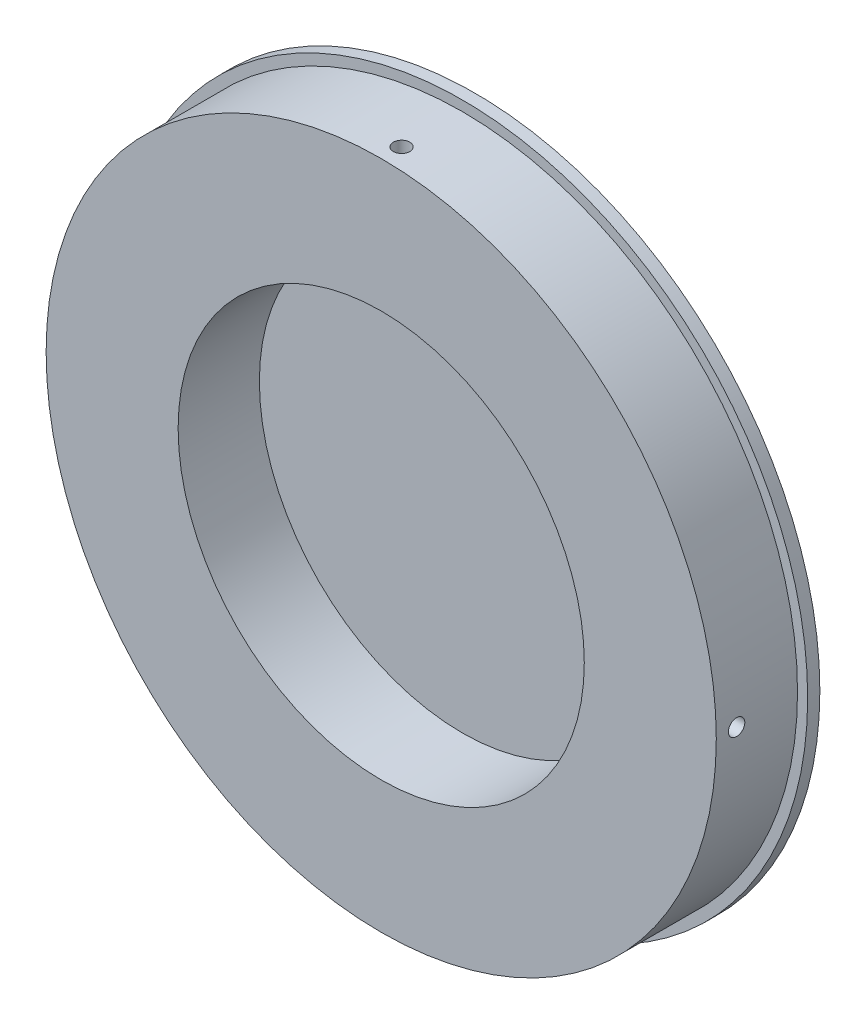
ISO-10303-21;
HEADER;
FILE_DESCRIPTION(('STEP AP214'),'2;1');
FILE_NAME('part.step','',(''),(''),'','','');
FILE_SCHEMA(('AUTOMOTIVE_DESIGN { 1 0 10303 214 1 1 1 1 }'));
ENDSEC;
DATA;
#1=APPLICATION_CONTEXT('core data for automotive mechanical design processes');
#2=APPLICATION_PROTOCOL_DEFINITION('international standard','automotive_design',2000,#1);
#3=PRODUCT_CONTEXT('',#1,'mechanical');
#4=PRODUCT('Part','Part','',(#3));
#5=PRODUCT_RELATED_PRODUCT_CATEGORY('part','',(#4));
#6=PRODUCT_DEFINITION_FORMATION('','',#4);
#7=PRODUCT_DEFINITION_CONTEXT('part definition',#1,'design');
#8=PRODUCT_DEFINITION('design','',#6,#7);
#9=PRODUCT_DEFINITION_SHAPE('','',#8);
#10=(LENGTH_UNIT() NAMED_UNIT(*) SI_UNIT(.MILLI.,.METRE.));
#11=(NAMED_UNIT(*) PLANE_ANGLE_UNIT() SI_UNIT($,.RADIAN.));
#12=(NAMED_UNIT(*) SI_UNIT($,.STERADIAN.) SOLID_ANGLE_UNIT());
#13=UNCERTAINTY_MEASURE_WITH_UNIT(LENGTH_MEASURE(1.E-05),#10,'distance_accuracy_value','');
#14=(GEOMETRIC_REPRESENTATION_CONTEXT(3) GLOBAL_UNCERTAINTY_ASSIGNED_CONTEXT((#13)) GLOBAL_UNIT_ASSIGNED_CONTEXT((#10,
#11,#12)) REPRESENTATION_CONTEXT('',''));
#15=CARTESIAN_POINT('',(0.,0.,0.));
#16=DIRECTION('',(0.,0.,1.));
#17=DIRECTION('',(1.,0.,0.));
#18=AXIS2_PLACEMENT_3D('',#15,#16,#17);
#19=CARTESIAN_POINT('',(0.,0.,23.));
#20=DIRECTION('',(0.,0.,-1.));
#21=DIRECTION('',(-1.,0.,0.));
#22=AXIS2_PLACEMENT_3D('',#19,#20,#21);
#23=CYLINDRICAL_SURFACE('',#22,82.5);
#24=CARTESIAN_POINT('',(82.5,0.,15.9807));
#25=CARTESIAN_POINT('',(82.4999996666297,-0.1134067445928,15.9807050235358));
#26=CARTESIAN_POINT('',(82.4997636527001,-0.226895287378577,15.9902856888799));
#27=CARTESIAN_POINT('',(82.498844835163,-0.450745589516307,16.028371214423));
#28=CARTESIAN_POINT('',(82.4981614965099,-0.561103439109121,16.0568987375818));
#29=CARTESIAN_POINT('',(82.4964254240408,-0.775417012689514,16.1320642577982));
#30=CARTESIAN_POINT('',(82.4953728695285,-0.879375815514723,16.1786934652409));
#31=CARTESIAN_POINT('',(82.4930171256612,-1.07796084138429,16.2887262920352));
#32=CARTESIAN_POINT('',(82.4917139978917,-1.17258934898132,16.3521257910555));
#33=CARTESIAN_POINT('',(82.4890033511544,-1.34989018576618,16.4939263721117));
#34=CARTESIAN_POINT('',(82.48759580185,-1.43255901966426,16.5723318242422));
#35=CARTESIAN_POINT('',(82.4848352221059,-1.58356466205927,16.741911690783));
#36=CARTESIAN_POINT('',(82.483482193829,-1.65190090244071,16.8330866111108));
#37=CARTESIAN_POINT('',(82.4809831204141,-1.77230463883914,17.0256272400537));
#38=CARTESIAN_POINT('',(82.4798370974276,-1.82437039419604,17.1269940374908));
#39=CARTESIAN_POINT('',(82.477881492917,-1.91074372500279,17.337033151369));
#40=CARTESIAN_POINT('',(82.4770719102687,-1.94505135979394,17.4457054433963));
#41=CARTESIAN_POINT('',(82.4758806618706,-1.99492804762409,17.6672476414711));
#42=CARTESIAN_POINT('',(82.4754989100679,-2.01050086898728,17.7801166986703));
#43=CARTESIAN_POINT('',(82.4752061073569,-2.02247746904215,18.0068676094531));
#44=CARTESIAN_POINT('',(82.4752950549144,-2.01888131021499,18.1207494597344));
#45=CARTESIAN_POINT('',(82.4759335402694,-1.99262525727334,18.3462676915282));
#46=CARTESIAN_POINT('',(82.4764829794106,-1.96996944651931,18.4579045487654));
#47=CARTESIAN_POINT('',(82.4779803524459,-1.90624351424478,18.6757898733805));
#48=CARTESIAN_POINT('',(82.4789282870648,-1.8651733592313,18.7820383309573));
#49=CARTESIAN_POINT('',(82.4811159009001,-1.76577989053998,18.9861439159084));
#50=CARTESIAN_POINT('',(82.4823556117813,-1.70745470409879,19.0840001309485));
#51=CARTESIAN_POINT('',(82.484986986921,-1.57520822943608,19.2685334022443));
#52=CARTESIAN_POINT('',(82.4863786513902,-1.50128691959968,19.3552104430063));
#53=CARTESIAN_POINT('',(82.489157485577,-1.33992344087389,19.5149487247769));
#54=CARTESIAN_POINT('',(82.490544654019,-1.25247772785785,19.5880063856707));
#55=CARTESIAN_POINT('',(82.4931577620787,-1.06656023711035,19.7184044897403));
#56=CARTESIAN_POINT('',(82.4943837016721,-0.968088457721153,19.775744930553));
#57=CARTESIAN_POINT('',(82.4965361602595,-0.76291215277011,19.8730804758592));
#58=CARTESIAN_POINT('',(82.4974626773547,-0.656207575006679,19.91307547036));
#59=CARTESIAN_POINT('',(82.498911812289,-0.437595549296186,19.9745825245343));
#60=CARTESIAN_POINT('',(82.4994344308658,-0.325688110854285,19.996094617973));
#61=CARTESIAN_POINT('',(82.5000167602246,-0.0998781489973501,20.020020833472));
#62=CARTESIAN_POINT('',(82.5000765910642,0.0140238492985089,20.0224399086942));
#63=CARTESIAN_POINT('',(82.4997269180994,0.240616951637763,20.0081243225889));
#64=CARTESIAN_POINT('',(82.4993174146498,0.353308056596517,19.9913896757416));
#65=CARTESIAN_POINT('',(82.4980753076527,0.574266652402211,19.9392457842576));
#66=CARTESIAN_POINT('',(82.497242754999,0.682534673663251,19.9038387859253));
#67=CARTESIAN_POINT('',(82.4952483817018,0.891590006507672,19.8153575588886));
#68=CARTESIAN_POINT('',(82.4940865606317,0.99237730840071,19.762283307299));
#69=CARTESIAN_POINT('',(82.4915642673822,1.18363300015171,19.639961407242));
#70=CARTESIAN_POINT('',(82.4902037542586,1.27409925631569,19.5707104235061));
#71=CARTESIAN_POINT('',(82.4874375624184,1.44212341399379,19.4180057499197));
#72=CARTESIAN_POINT('',(82.486031883619,1.51968129182415,19.3345520340112));
#73=CARTESIAN_POINT('',(82.4833334899435,1.6597035937652,19.1557896513498));
#74=CARTESIAN_POINT('',(82.4820407990242,1.72216482187854,19.0604784808027));
#75=CARTESIAN_POINT('',(82.4797145021758,1.83019889289644,18.860719582373));
#76=CARTESIAN_POINT('',(82.4786808957665,1.87577176710564,18.7562718714265));
#77=CARTESIAN_POINT('',(82.4769894736531,1.94872989627561,18.5412168518254));
#78=CARTESIAN_POINT('',(82.4763316150783,1.97611722616477,18.4306102474478));
#79=CARTESIAN_POINT('',(82.4754657386439,2.01193365071974,18.206367117441));
#80=CARTESIAN_POINT('',(82.4752577207924,2.02036274504609,18.0927305917577));
#81=CARTESIAN_POINT('',(82.4753149949794,2.01802316260126,17.8656854956158));
#82=CARTESIAN_POINT('',(82.4755801624859,2.00725953693089,17.7522768730417));
#83=CARTESIAN_POINT('',(82.4765536524283,1.966850416689,17.5288768036462));
#84=CARTESIAN_POINT('',(82.4772619757474,1.93720488448521,17.4188853636359));
#85=CARTESIAN_POINT('',(82.4790419123397,1.85987393754577,17.2054393915149));
#86=CARTESIAN_POINT('',(82.4801135320113,1.81218820508996,17.1019849745704));
#87=CARTESIAN_POINT('',(82.4824992031599,1.70013290905002,16.9045531243145));
#88=CARTESIAN_POINT('',(82.4838132456183,1.63576396608429,16.8105753386512));
#89=CARTESIAN_POINT('',(82.4865359362514,1.49215719781432,16.6347428508357));
#90=CARTESIAN_POINT('',(82.4879445992233,1.41291704337648,16.5528900513006));
#91=CARTESIAN_POINT('',(82.4906979445181,1.24179657901145,16.4036274790835));
#92=CARTESIAN_POINT('',(82.492042610892,1.14991314015949,16.3362212922028));
#93=CARTESIAN_POINT('',(82.4945167550373,0.956085100302505,16.2177576134748));
#94=CARTESIAN_POINT('',(82.495646105187,0.854134586371129,16.166709805389));
#95=CARTESIAN_POINT('',(82.4975599045913,0.643186597503595,16.0825143703101));
#96=CARTESIAN_POINT('',(82.4983447656533,0.534197716197418,16.0493453598489));
#97=CARTESIAN_POINT('',(82.4992709779592,0.353765256868499,16.0106559490644));
#98=CARTESIAN_POINT('',(82.499543177877,0.283493259589423,15.9994365643579));
#99=CARTESIAN_POINT('',(82.4999077933756,0.142158223915978,15.9844570159129));
#100=CARTESIAN_POINT('',(82.5000002089913,0.0710951856755066,15.9806968507233));
#101=CARTESIAN_POINT('',(82.5,0.,15.9807));
#102=B_SPLINE_CURVE_WITH_KNOTS('',3,(#24,#25,#26,#27,#28,#29,#30,#31,#32,#33,#34,#35,#36,#37,
#38,#39,#40,#41,#42,#43,#44,#45,#46,#47,#48,#49,#50,#51,#52,#53,#54,#55,#56,#57,#58,#59,#60,#61,
#62,#63,#64,#65,#66,#67,#68,#69,#70,#71,#72,#73,#74,#75,#76,#77,#78,#79,#80,#81,#82,#83,#84,#85,
#86,#87,#88,#89,#90,#91,#92,#93,#94,#95,#96,#97,#98,#99,#100,#101),.UNSPECIFIED.,.T.,.F.,(4,2,2,
2,2,2,2,2,2,2,2,2,2,2,2,2,2,2,2,2,2,2,2,2,2,2,2,2,2,2,2,2,2,2,2,2,2,2,4),(0.,0.33996073027684,
0.680328832871509,1.02053186960826,1.36065139859639,1.70087012970974,2.04110234386893,
2.38137094453113,2.72163840812978,3.0618374188123,3.40203532061919,3.74216035661495,
4.08228601125048,4.42244859474933,4.76261164968745,5.10286399729623,5.44311639606132,
5.78337095243719,6.12362488722285,6.463790549521,6.80395595465706,7.1440804468546,
7.48420537963352,7.8244005003087,8.16459624515314,8.50486394730253,8.84513101872099,
9.18535925978231,9.52558750693556,9.86572622672961,10.2058656244336,10.5460110128788,
10.8861437496706,11.2263298026786,11.566600195905,11.9070716503906,12.2471349842186,
12.4602578988239,12.6733807719669),.UNSPECIFIED.);
#103=CARTESIAN_POINT('',(82.5,0.,15.9807));
#104=VERTEX_POINT('',#103);
#105=EDGE_CURVE('E42',#104,#104,#102,.T.);
#106=ORIENTED_EDGE('',*,*,#105,.T.);
#107=EDGE_LOOP('',(#106));
#108=FACE_BOUND('',#107,.T.);
#109=CARTESIAN_POINT('',(0.,0.,23.));
#110=DIRECTION('',(0.,0.,1.));
#111=DIRECTION('',(1.,0.,0.));
#112=AXIS2_PLACEMENT_3D('',#109,#110,#111);
#113=CIRCLE('',#112,82.5);
#114=CARTESIAN_POINT('',(82.5,0.,23.));
#115=VERTEX_POINT('',#114);
#116=EDGE_CURVE('E96',#115,#115,#113,.T.);
#117=ORIENTED_EDGE('',*,*,#116,.F.);
#118=EDGE_LOOP('',(#117));
#119=FACE_BOUND('',#118,.T.);
#120=CARTESIAN_POINT('',(0.,0.,3.));
#121=DIRECTION('',(0.,0.,1.));
#122=DIRECTION('',(1.,0.,0.));
#123=AXIS2_PLACEMENT_3D('',#120,#121,#122);
#124=CIRCLE('',#123,82.5);
#125=CARTESIAN_POINT('',(82.5,0.,3.));
#126=VERTEX_POINT('',#125);
#127=EDGE_CURVE('E99',#126,#126,#124,.T.);
#128=ORIENTED_EDGE('',*,*,#127,.T.);
#129=EDGE_LOOP('',(#128));
#130=FACE_BOUND('',#129,.T.);
#131=CARTESIAN_POINT('',(-2.0193,82.4752837370688,18.));
#132=CARTESIAN_POINT('',(-2.01929497645894,82.4752840708288,18.1134067388541));
#133=CARTESIAN_POINT('',(-2.00971431205175,82.475520157458,18.226895275921));
#134=CARTESIAN_POINT('',(-1.97162879056804,82.4764392343232,18.4507455661764));
#135=CARTESIAN_POINT('',(-1.94310127051253,82.4771227597418,18.5611034096013));
#136=CARTESIAN_POINT('',(-1.86793575937624,82.4788592377726,18.7754169701443));
#137=CARTESIAN_POINT('',(-1.82130655805858,82.4799120110624,18.8793757661523));
#138=CARTESIAN_POINT('',(-1.71127374568386,82.4822681285276,19.0779607806211));
#139=CARTESIAN_POINT('',(-1.64787425494274,82.4835714111336,19.1725892836259));
#140=CARTESIAN_POINT('',(-1.50607368221338,82.4862822361354,19.3498901256838));
#141=CARTESIAN_POINT('',(-1.42766822828455,82.4876898088425,19.4325589679718));
#142=CARTESIAN_POINT('',(-1.25808835463563,82.4904502933808,19.5835646265347));
#143=CARTESIAN_POINT('',(-1.16691342902079,82.4918032030438,19.6519008747199));
#144=CARTESIAN_POINT('',(-0.974372795532834,82.494301949183,19.7723046192105));
#145=CARTESIAN_POINT('',(-0.873005999745911,82.4954477635167,19.8243703763081));
#146=CARTESIAN_POINT('',(-0.662966889456172,82.4974029521619,19.9107437107897));
#147=CARTESIAN_POINT('',(-0.554294599358348,82.4982123275973,19.9450513474938));
#148=CARTESIAN_POINT('',(-0.332752406838254,82.4994032539983,19.9949280394221));
#149=CARTESIAN_POINT('',(-0.219883353293958,82.4997848910012,20.0105008631033));
#150=CARTESIAN_POINT('',(0.00686755035890332,82.5000776067226,20.0224774690602));
#151=CARTESIAN_POINT('',(0.120749397166355,82.4999886869742,20.0188813137927));
#152=CARTESIAN_POINT('',(0.346267644856789,82.4993503877066,19.9926252664131));
#153=CARTESIAN_POINT('',(0.457904521046959,82.4988011067292,19.9699694540801));
#154=CARTESIAN_POINT('',(0.675789882754999,82.4973041109405,19.9062435120491));
#155=CARTESIAN_POINT('',(0.782038358482037,82.4963563954052,19.8651733488933));
#156=CARTESIAN_POINT('',(0.986143965147897,82.4941691849238,19.7657798634957));
#157=CARTESIAN_POINT('',(1.08400018469023,82.4929296583416,19.7074546704158));
#158=CARTESIAN_POINT('',(1.2685334621602,82.4902985360633,19.5752081816659));
#159=CARTESIAN_POINT('',(1.35521050459108,82.4889069401565,19.5012868643766));
#160=CARTESIAN_POINT('',(1.51494877766844,82.4861280975822,19.3399233804541));
#161=CARTESIAN_POINT('',(1.58800642971264,82.4847408521519,19.2524776711924));
#162=CARTESIAN_POINT('',(1.71840451772895,82.4821274780062,19.0665601910769));
#163=CARTESIAN_POINT('',(1.77574495132039,82.4809013493153,18.9680884185531));
#164=CARTESIAN_POINT('',(1.87308049146376,82.4787484832672,18.7629121152687));
#165=CARTESIAN_POINT('',(1.91307548575991,82.4778217478476,18.6562075312325));
#166=CARTESIAN_POINT('',(1.97458253759421,82.476372242823,18.4375954919168));
#167=CARTESIAN_POINT('',(1.99609462893446,82.4758494724792,18.325688046153));
#168=CARTESIAN_POINT('',(2.02002083655087,82.4752669728671,18.0998780811994));
#169=CARTESIAN_POINT('',(2.02243990799055,82.4752071234582,17.9859760873411));
#170=CARTESIAN_POINT('',(2.00812431590517,82.475556900407,17.7593829947924));
#171=CARTESIAN_POINT('',(1.99138966685967,82.4759665264096,17.6466918951865));
#172=CARTESIAN_POINT('',(1.93924577629765,82.4772089659546,17.4257333244464));
#173=CARTESIAN_POINT('',(1.90383878330502,82.4780417285423,17.3174653223736));
#174=CARTESIAN_POINT('',(1.8153575733931,82.4800365170439,17.1084100255345));
#175=CARTESIAN_POINT('',(1.76228333355743,82.481198543385,17.0076227404716));
#176=CARTESIAN_POINT('',(1.63996145052811,82.4837211529658,16.8163670597102));
#177=CARTESIAN_POINT('',(1.5707104690743,82.4850817771667,16.7259007996192));
#178=CARTESIAN_POINT('',(1.41800579785062,82.4878480479608,16.5578766329504));
#179=CARTESIAN_POINT('',(1.33455208204102,82.4892536946364,16.4803187500398));
#180=CARTESIAN_POINT('',(1.15578969706604,82.491951895022,16.3402964378001));
#181=CARTESIAN_POINT('',(1.06047852410772,82.4932444247479,16.2778352044661));
#182=CARTESIAN_POINT('',(0.86071961952719,82.4955703406699,16.169801124273));
#183=CARTESIAN_POINT('',(0.756271904841076,82.4966037273464,16.1242282461094));
#184=CARTESIAN_POINT('',(0.541216888152822,82.4982947478319,16.0512701141697));
#185=CARTESIAN_POINT('',(0.430610291007318,82.4989524245427,16.0238827837567));
#186=CARTESIAN_POINT('',(0.206367176198234,82.4998180548363,15.988066355701));
#187=CARTESIAN_POINT('',(0.0927306584742971,82.50002600841,15.9796372584359));
#188=CARTESIAN_POINT('',(-0.134314443261793,82.4999687515582,15.9819768326005));
#189=CARTESIAN_POINT('',(-0.247723079353247,82.4997036655403,15.9927404564149));
#190=CARTESIAN_POINT('',(-0.471123176229049,82.4987304484277,16.0331495777141));
#191=CARTESIAN_POINT('',(-0.581114630206789,82.4980223164505,16.0627951128068));
#192=CARTESIAN_POINT('',(-0.794560629288426,82.496242788676,16.1401260704685));
#193=CARTESIAN_POINT('',(-0.898015059234618,82.4951713864813,16.1878118107345));
#194=CARTESIAN_POINT('',(-1.09544693221359,82.4927860810099,16.2998671263952));
#195=CARTESIAN_POINT('',(-1.18942472760608,82.4914721867546,16.3642360811574));
#196=CARTESIAN_POINT('',(-1.36525721408104,82.4887496587193,16.5078428620785));
#197=CARTESIAN_POINT('',(-1.44711000473028,82.4873410101381,16.5870830146969));
#198=CARTESIAN_POINT('',(-1.59637255987259,82.4845875531439,16.7582034718125));
#199=CARTESIAN_POINT('',(-1.66377873854164,82.4832427606452,16.8500869052535));
#200=CARTESIAN_POINT('',(-1.78224240879833,82.4807682789368,17.0439149410359));
#201=CARTESIAN_POINT('',(-1.8332902150506,82.4796387173193,17.1458654572637));
#202=CARTESIAN_POINT('',(-1.91748564605744,82.47772450271,17.356813451063));
#203=CARTESIAN_POINT('',(-1.95065465430993,82.4769394379012,17.4658023349921));
#204=CARTESIAN_POINT('',(-1.98934405863892,82.4760129724474,17.6462347883777));
#205=CARTESIAN_POINT('',(-2.00056344044816,82.4757406938983,17.716506776635));
#206=CARTESIAN_POINT('',(-2.01554298504225,82.4753759716087,17.8578417942183));
#207=CARTESIAN_POINT('',(-2.01930314927969,82.4752835278332,17.9289048233902));
#208=CARTESIAN_POINT('',(-2.0193,82.4752837370688,18.));
#209=B_SPLINE_CURVE_WITH_KNOTS('',3,(#131,#132,#133,#134,#135,#136,#137,#138,#139,#140,#141,
#142,#143,#144,#145,#146,#147,#148,#149,#150,#151,#152,#153,#154,#155,#156,#157,#158,#159,#160,
#161,#162,#163,#164,#165,#166,#167,#168,#169,#170,#171,#172,#173,#174,#175,#176,#177,#178,#179,
#180,#181,#182,#183,#184,#185,#186,#187,#188,#189,#190,#191,#192,#193,#194,#195,#196,#197,#198,
#199,#200,#201,#202,#203,#204,#205,#206,#207,#208),.UNSPECIFIED.,.T.,.F.,(4,2,2,2,2,2,2,2,2,2,2,
2,2,2,2,2,2,2,2,2,2,2,2,2,2,2,2,2,2,2,2,2,2,2,2,2,2,2,4),(0.,0.339960713043313,
0.680328798778711,1.02053181585746,1.36065132549033,1.70087007914485,2.04110231523603,
2.38137090747195,2.7216383630511,3.06183736330333,3.40203525511153,3.74216034502117,
4.08228605292274,4.42244865172257,4.76261172205634,5.10286404732622,5.44311642413373,
5.783371002945,6.12362495948679,6.46379060786874,6.80395599909741,7.14408043695603,
7.48420531599539,7.82440044589107,8.16459619951766,8.50486391039977,8.84513099055284,
9.18535920837558,9.52558743297574,9.86572619199902,10.2058656284935,10.5460110552921,
10.8861438301548,11.2263298600257,11.566600230648,11.9070716952108,12.2471350385437,
12.4602579259947,12.6733807719422),.UNSPECIFIED.);
#210=CARTESIAN_POINT('',(-2.0193,82.4752837370688,18.));
#211=VERTEX_POINT('',#210);
#212=EDGE_CURVE('E50',#211,#211,#209,.T.);
#213=ORIENTED_EDGE('',*,*,#212,.F.);
#214=EDGE_LOOP('',(#213));
#215=FACE_BOUND('',#214,.T.);
#216=CARTESIAN_POINT('',(0.,-82.5,15.9807));
#217=CARTESIAN_POINT('',(0.113406744592799,-82.4999996666297,15.9807050235358));
#218=CARTESIAN_POINT('',(0.226895287378577,-82.4997636527001,15.9902856888799));
#219=CARTESIAN_POINT('',(0.450745589516307,-82.498844835163,16.028371214423));
#220=CARTESIAN_POINT('',(0.561103439109121,-82.4981614965099,16.0568987375818));
#221=CARTESIAN_POINT('',(0.775417012689515,-82.4964254240408,16.1320642577982));
#222=CARTESIAN_POINT('',(0.879375815514724,-82.4953728695285,16.1786934652409));
#223=CARTESIAN_POINT('',(1.07796084138429,-82.4930171256612,16.2887262920352));
#224=CARTESIAN_POINT('',(1.17258934898132,-82.4917139978917,16.3521257910555));
#225=CARTESIAN_POINT('',(1.34989018576618,-82.4890033511544,16.4939263721117));
#226=CARTESIAN_POINT('',(1.43255901966426,-82.48759580185,16.5723318242422));
#227=CARTESIAN_POINT('',(1.58356466205927,-82.4848352221059,16.741911690783));
#228=CARTESIAN_POINT('',(1.65190090244071,-82.483482193829,16.8330866111108));
#229=CARTESIAN_POINT('',(1.77230463883914,-82.4809831204141,17.0256272400537));
#230=CARTESIAN_POINT('',(1.82437039419604,-82.4798370974276,17.1269940374908));
#231=CARTESIAN_POINT('',(1.91074372500279,-82.477881492917,17.337033151369));
#232=CARTESIAN_POINT('',(1.94505135979395,-82.4770719102687,17.4457054433963));
#233=CARTESIAN_POINT('',(1.99492804762409,-82.4758806618706,17.6672476414711));
#234=CARTESIAN_POINT('',(2.01050086898728,-82.4754989100679,17.7801166986703));
#235=CARTESIAN_POINT('',(2.02247746904215,-82.4752061073569,18.0068676094531));
#236=CARTESIAN_POINT('',(2.01888131021499,-82.4752950549144,18.1207494597344));
#237=CARTESIAN_POINT('',(1.99262525727334,-82.4759335402694,18.3462676915282));
#238=CARTESIAN_POINT('',(1.96996944651931,-82.4764829794106,18.4579045487654));
#239=CARTESIAN_POINT('',(1.90624351424478,-82.4779803524459,18.6757898733805));
#240=CARTESIAN_POINT('',(1.8651733592313,-82.4789282870648,18.7820383309573));
#241=CARTESIAN_POINT('',(1.76577989053999,-82.4811159009001,18.9861439159084));
#242=CARTESIAN_POINT('',(1.70745470409879,-82.4823556117813,19.0840001309485));
#243=CARTESIAN_POINT('',(1.57520822943608,-82.484986986921,19.2685334022443));
#244=CARTESIAN_POINT('',(1.50128691959968,-82.4863786513902,19.3552104430063));
#245=CARTESIAN_POINT('',(1.33992344087389,-82.489157485577,19.5149487247769));
#246=CARTESIAN_POINT('',(1.25247772785785,-82.490544654019,19.5880063856707));
#247=CARTESIAN_POINT('',(1.06656023711035,-82.4931577620787,19.7184044897403));
#248=CARTESIAN_POINT('',(0.968088457721155,-82.4943837016721,19.775744930553));
#249=CARTESIAN_POINT('',(0.762912152770112,-82.4965361602595,19.8730804758592));
#250=CARTESIAN_POINT('',(0.656207575006682,-82.4974626773547,19.91307547036));
#251=CARTESIAN_POINT('',(0.437595549296189,-82.498911812289,19.9745825245343));
#252=CARTESIAN_POINT('',(0.325688110854286,-82.4994344308658,19.996094617973));
#253=CARTESIAN_POINT('',(0.0998781489973512,-82.5000167602246,20.020020833472));
#254=CARTESIAN_POINT('',(-0.0140238492985076,-82.5000765910642,20.0224399086942));
#255=CARTESIAN_POINT('',(-0.240616951637762,-82.4997269180994,20.0081243225889));
#256=CARTESIAN_POINT('',(-0.353308056596517,-82.4993174146498,19.9913896757416));
#257=CARTESIAN_POINT('',(-0.574266652402212,-82.4980753076527,19.9392457842576));
#258=CARTESIAN_POINT('',(-0.682534673663252,-82.497242754999,19.9038387859253));
#259=CARTESIAN_POINT('',(-0.891590006507673,-82.4952483817018,19.8153575588886));
#260=CARTESIAN_POINT('',(-0.992377308400711,-82.4940865606317,19.762283307299));
#261=CARTESIAN_POINT('',(-1.18363300015171,-82.4915642673822,19.639961407242));
#262=CARTESIAN_POINT('',(-1.27409925631569,-82.4902037542586,19.5707104235061));
#263=CARTESIAN_POINT('',(-1.4421234139938,-82.4874375624184,19.4180057499197));
#264=CARTESIAN_POINT('',(-1.51968129182416,-82.486031883619,19.3345520340112));
#265=CARTESIAN_POINT('',(-1.65970359376521,-82.4833334899435,19.1557896513498));
#266=CARTESIAN_POINT('',(-1.72216482187854,-82.4820407990242,19.0604784808027));
#267=CARTESIAN_POINT('',(-1.83019889289645,-82.4797145021758,18.860719582373));
#268=CARTESIAN_POINT('',(-1.87577176710564,-82.4786808957665,18.7562718714265));
#269=CARTESIAN_POINT('',(-1.94872989627561,-82.4769894736531,18.5412168518254));
#270=CARTESIAN_POINT('',(-1.97611722616477,-82.4763316150783,18.4306102474478));
#271=CARTESIAN_POINT('',(-2.01193365071974,-82.4754657386439,18.206367117441));
#272=CARTESIAN_POINT('',(-2.02036274504609,-82.4752577207924,18.0927305917577));
#273=CARTESIAN_POINT('',(-2.01802316260126,-82.4753149949794,17.8656854956158));
#274=CARTESIAN_POINT('',(-2.00725953693089,-82.4755801624859,17.7522768730417));
#275=CARTESIAN_POINT('',(-1.966850416689,-82.4765536524283,17.5288768036462));
#276=CARTESIAN_POINT('',(-1.93720488448522,-82.4772619757474,17.4188853636359));
#277=CARTESIAN_POINT('',(-1.85987393754577,-82.4790419123397,17.2054393915149));
#278=CARTESIAN_POINT('',(-1.81218820508996,-82.4801135320113,17.1019849745704));
#279=CARTESIAN_POINT('',(-1.70013290905002,-82.4824992031599,16.9045531243145));
#280=CARTESIAN_POINT('',(-1.63576396608429,-82.4838132456183,16.8105753386512));
#281=CARTESIAN_POINT('',(-1.49215719781433,-82.4865359362514,16.6347428508357));
#282=CARTESIAN_POINT('',(-1.41291704337649,-82.4879445992233,16.5528900513006));
#283=CARTESIAN_POINT('',(-1.24179657901145,-82.4906979445181,16.4036274790835));
#284=CARTESIAN_POINT('',(-1.1499131401595,-82.492042610892,16.3362212922028));
#285=CARTESIAN_POINT('',(-0.956085100302508,-82.4945167550373,16.2177576134748));
#286=CARTESIAN_POINT('',(-0.854134586371132,-82.495646105187,16.166709805389));
#287=CARTESIAN_POINT('',(-0.643186597503598,-82.4975599045913,16.0825143703101));
#288=CARTESIAN_POINT('',(-0.53419771619742,-82.4983447656533,16.0493453598489));
#289=CARTESIAN_POINT('',(-0.353765256868501,-82.4992709779592,16.0106559490644));
#290=CARTESIAN_POINT('',(-0.283493259589424,-82.499543177877,15.9994365643579));
#291=CARTESIAN_POINT('',(-0.142158223915979,-82.4999077933756,15.9844570159129));
#292=CARTESIAN_POINT('',(-0.0710951856755071,-82.5000002089913,15.9806968507233));
#293=CARTESIAN_POINT('',(0.,-82.5,15.9807));
#294=B_SPLINE_CURVE_WITH_KNOTS('',3,(#216,#217,#218,#219,#220,#221,#222,#223,#224,#225,#226,
#227,#228,#229,#230,#231,#232,#233,#234,#235,#236,#237,#238,#239,#240,#241,#242,#243,#244,#245,
#246,#247,#248,#249,#250,#251,#252,#253,#254,#255,#256,#257,#258,#259,#260,#261,#262,#263,#264,
#265,#266,#267,#268,#269,#270,#271,#272,#273,#274,#275,#276,#277,#278,#279,#280,#281,#282,#283,
#284,#285,#286,#287,#288,#289,#290,#291,#292,#293),.UNSPECIFIED.,.T.,.F.,(4,2,2,2,2,2,2,2,2,2,2,
2,2,2,2,2,2,2,2,2,2,2,2,2,2,2,2,2,2,2,2,2,2,2,2,2,2,2,4),(0.,0.339960730276839,0.68032883287151,
1.02053186960826,1.36065139859639,1.70087012970974,2.04110234386894,2.38137094453113,
2.72163840812979,3.0618374188123,3.40203532061919,3.74216035661495,4.08228601125048,
4.42244859474933,4.76261164968745,5.10286399729623,5.44311639606132,5.78337095243719,
6.12362488722285,6.463790549521,6.80395595465706,7.14408044685461,7.48420537963352,
7.8244005003087,8.16459624515314,8.50486394730254,8.845131018721,9.18535925978232,
9.52558750693557,9.86572622672962,10.2058656244336,10.5460110128788,10.8861437496706,
11.2263298026786,11.566600195905,11.9070716503906,12.2471349842187,12.4602578988239,
12.6733807719669),.UNSPECIFIED.);
#295=CARTESIAN_POINT('',(0.,-82.5,15.9807));
#296=VERTEX_POINT('',#295);
#297=EDGE_CURVE('E46',#296,#296,#294,.T.);
#298=ORIENTED_EDGE('',*,*,#297,.F.);
#299=EDGE_LOOP('',(#298));
#300=FACE_BOUND('',#299,.T.);
#301=CARTESIAN_POINT('',(-82.5,0.,20.0193));
#302=CARTESIAN_POINT('',(-82.4999996666297,0.1134067445928,20.0192949764641));
#303=CARTESIAN_POINT('',(-82.4997636527001,0.226895287378577,20.0097143111201));
#304=CARTESIAN_POINT('',(-82.498844835163,0.450745589516307,19.971628785577));
#305=CARTESIAN_POINT('',(-82.4981614965099,0.561103439109121,19.9431012624182));
#306=CARTESIAN_POINT('',(-82.4964254240408,0.775417012689514,19.8679357422018));
#307=CARTESIAN_POINT('',(-82.4953728695285,0.87937581551472,19.8213065347591));
#308=CARTESIAN_POINT('',(-82.4930171256612,1.07796084138428,19.7112737079648));
#309=CARTESIAN_POINT('',(-82.4917139978917,1.17258934898132,19.6478742089445));
#310=CARTESIAN_POINT('',(-82.4890033511544,1.34989018576618,19.5060736278883));
#311=CARTESIAN_POINT('',(-82.48759580185,1.43255901966426,19.4276681757578));
#312=CARTESIAN_POINT('',(-82.4848352221059,1.58356466205926,19.258088309217));
#313=CARTESIAN_POINT('',(-82.483482193829,1.65190090244071,19.1669133888892));
#314=CARTESIAN_POINT('',(-82.4809831204141,1.77230463883914,18.9743727599463));
#315=CARTESIAN_POINT('',(-82.4798370974276,1.82437039419604,18.8730059625092));
#316=CARTESIAN_POINT('',(-82.477881492917,1.91074372500279,18.662966848631));
#317=CARTESIAN_POINT('',(-82.4770719102687,1.94505135979394,18.5542945566037));
#318=CARTESIAN_POINT('',(-82.4758806618706,1.99492804762409,18.3327523585289));
#319=CARTESIAN_POINT('',(-82.4754989100679,2.01050086898728,18.2198833013297));
#320=CARTESIAN_POINT('',(-82.4752061073569,2.02247746904215,17.9931323905468));
#321=CARTESIAN_POINT('',(-82.4752950549144,2.01888131021498,17.8792505402655));
#322=CARTESIAN_POINT('',(-82.4759335402694,1.99262525727333,17.6537323084718));
#323=CARTESIAN_POINT('',(-82.4764829794106,1.96996944651931,17.5420954512346));
#324=CARTESIAN_POINT('',(-82.4779803524459,1.90624351424477,17.3242101266195));
#325=CARTESIAN_POINT('',(-82.4789282870648,1.86517335923129,17.2179616690427));
#326=CARTESIAN_POINT('',(-82.4811159009001,1.76577989053998,17.0138560840916));
#327=CARTESIAN_POINT('',(-82.4823556117813,1.70745470409878,16.9159998690515));
#328=CARTESIAN_POINT('',(-82.484986986921,1.57520822943607,16.7314665977557));
#329=CARTESIAN_POINT('',(-82.4863786513902,1.50128691959967,16.6447895569937));
#330=CARTESIAN_POINT('',(-82.489157485577,1.33992344087389,16.4850512752231));
#331=CARTESIAN_POINT('',(-82.490544654019,1.25247772785784,16.4119936143293));
#332=CARTESIAN_POINT('',(-82.4931577620787,1.06656023711034,16.2815955102597));
#333=CARTESIAN_POINT('',(-82.4943837016721,0.968088457721147,16.224255069447));
#334=CARTESIAN_POINT('',(-82.4965361602595,0.762912152770105,16.1269195241408));
#335=CARTESIAN_POINT('',(-82.4974626773547,0.656207575006674,16.08692452964));
#336=CARTESIAN_POINT('',(-82.498911812289,0.437595549296179,16.0254174754657));
#337=CARTESIAN_POINT('',(-82.4994344308658,0.325688110854277,16.003905382027));
#338=CARTESIAN_POINT('',(-82.5000167602246,0.099878148997342,15.979979166528));
#339=CARTESIAN_POINT('',(-82.5000765910642,-0.0140238492985168,15.9775600913058));
#340=CARTESIAN_POINT('',(-82.4997269180994,-0.24061695163777,15.9918756774111));
#341=CARTESIAN_POINT('',(-82.4993174146498,-0.353308056596525,16.0086103242584));
#342=CARTESIAN_POINT('',(-82.4980753076527,-0.574266652402219,16.0607542157424));
#343=CARTESIAN_POINT('',(-82.497242754999,-0.682534673663259,16.0961612140747));
#344=CARTESIAN_POINT('',(-82.4952483817018,-0.89159000650768,16.1846424411114));
#345=CARTESIAN_POINT('',(-82.4940865606317,-0.992377308400717,16.237716692701));
#346=CARTESIAN_POINT('',(-82.4915642673822,-1.18363300015172,16.360038592758));
#347=CARTESIAN_POINT('',(-82.4902037542586,-1.27409925631569,16.4292895764939));
#348=CARTESIAN_POINT('',(-82.4874375624184,-1.4421234139938,16.5819942500803));
#349=CARTESIAN_POINT('',(-82.486031883619,-1.51968129182416,16.6654479659888));
#350=CARTESIAN_POINT('',(-82.4833334899435,-1.65970359376521,16.8442103486502));
#351=CARTESIAN_POINT('',(-82.4820407990242,-1.72216482187855,16.9395215191973));
#352=CARTESIAN_POINT('',(-82.4797145021758,-1.83019889289645,17.139280417627));
#353=CARTESIAN_POINT('',(-82.4786808957665,-1.87577176710564,17.2437281285735));
#354=CARTESIAN_POINT('',(-82.4769894736531,-1.94872989627561,17.4587831481746));
#355=CARTESIAN_POINT('',(-82.4763316150783,-1.97611722616478,17.5693897525523));
#356=CARTESIAN_POINT('',(-82.4754657386439,-2.01193365071975,17.793632882559));
#357=CARTESIAN_POINT('',(-82.4752577207924,-2.0203627450461,17.9072694082423));
#358=CARTESIAN_POINT('',(-82.4753149949794,-2.01802316260126,18.1343145043842));
#359=CARTESIAN_POINT('',(-82.4755801624859,-2.00725953693089,18.2477231269583));
#360=CARTESIAN_POINT('',(-82.4765536524283,-1.966850416689,18.4711231963538));
#361=CARTESIAN_POINT('',(-82.4772619757474,-1.93720488448522,18.5811146363641));
#362=CARTESIAN_POINT('',(-82.4790419123397,-1.85987393754577,18.7945606084851));
#363=CARTESIAN_POINT('',(-82.4801135320113,-1.81218820508996,18.8980150254296));
#364=CARTESIAN_POINT('',(-82.4824992031599,-1.70013290905002,19.0954468756855));
#365=CARTESIAN_POINT('',(-82.4838132456183,-1.63576396608429,19.1894246613488));
#366=CARTESIAN_POINT('',(-82.4865359362514,-1.49215719781432,19.3652571491643));
#367=CARTESIAN_POINT('',(-82.4879445992233,-1.41291704337648,19.4471099486994));
#368=CARTESIAN_POINT('',(-82.4906979445181,-1.24179657901145,19.5963725209165));
#369=CARTESIAN_POINT('',(-82.492042610892,-1.14991314015949,19.6637787077972));
#370=CARTESIAN_POINT('',(-82.4945167550373,-0.956085100302505,19.7822423865252));
#371=CARTESIAN_POINT('',(-82.495646105187,-0.854134586371129,19.833290194611));
#372=CARTESIAN_POINT('',(-82.4975599045913,-0.643186597503595,19.9174856296899));
#373=CARTESIAN_POINT('',(-82.4983447656533,-0.534197716197417,19.9506546401511));
#374=CARTESIAN_POINT('',(-82.4992709779592,-0.353765256868499,19.9893440509356));
#375=CARTESIAN_POINT('',(-82.499543177877,-0.283493259589423,20.0005634356421));
#376=CARTESIAN_POINT('',(-82.4999077933756,-0.142158223915978,20.0155429840871));
#377=CARTESIAN_POINT('',(-82.5000002089913,-0.0710951856755065,20.0193031492767));
#378=CARTESIAN_POINT('',(-82.5,0.,20.0193));
#379=B_SPLINE_CURVE_WITH_KNOTS('',3,(#301,#302,#303,#304,#305,#306,#307,#308,#309,#310,#311,
#312,#313,#314,#315,#316,#317,#318,#319,#320,#321,#322,#323,#324,#325,#326,#327,#328,#329,#330,
#331,#332,#333,#334,#335,#336,#337,#338,#339,#340,#341,#342,#343,#344,#345,#346,#347,#348,#349,
#350,#351,#352,#353,#354,#355,#356,#357,#358,#359,#360,#361,#362,#363,#364,#365,#366,#367,#368,
#369,#370,#371,#372,#373,#374,#375,#376,#377,#378),.UNSPECIFIED.,.T.,.F.,(4,2,2,2,2,2,2,2,2,2,2,
2,2,2,2,2,2,2,2,2,2,2,2,2,2,2,2,2,2,2,2,2,2,2,2,2,2,2,4),(0.,0.33996073027684,0.680328832871509,
1.02053186960826,1.36065139859639,1.70087012970974,2.04110234386894,2.38137094453113,
2.72163840812978,3.0618374188123,3.40203532061919,3.74216035661494,4.08228601125048,
4.42244859474933,4.76261164968745,5.10286399729622,5.44311639606132,5.78337095243719,
6.12362488722285,6.46379054952099,6.80395595465706,7.1440804468546,7.48420537963352,
7.8244005003087,8.16459624515314,8.50486394730253,8.84513101872099,9.18535925978232,
9.52558750693556,9.86572622672961,10.2058656244336,10.5460110128788,10.8861437496706,
11.2263298026786,11.566600195905,11.9070716503906,12.2471349842186,12.4602578988239,
12.6733807719669),.UNSPECIFIED.);
#380=CARTESIAN_POINT('',(-82.5,0.,20.0193));
#381=VERTEX_POINT('',#380);
#382=EDGE_CURVE('E10',#381,#381,#379,.T.);
#383=ORIENTED_EDGE('',*,*,#382,.F.);
#384=EDGE_LOOP('',(#383));
#385=FACE_BOUND('',#384,.T.);
#386=ADVANCED_FACE('F31',(#108,#119,#130,#215,#300,#385),#23,.T.);
#387=CARTESIAN_POINT('',(0.,0.,3.));
#388=DIRECTION('',(0.,0.,-1.));
#389=DIRECTION('',(-1.,0.,0.));
#390=AXIS2_PLACEMENT_3D('',#387,#388,#389);
#391=CYLINDRICAL_SURFACE('',#390,85.);
#392=CARTESIAN_POINT('',(0.,0.,3.));
#393=DIRECTION('',(0.,0.,1.));
#394=DIRECTION('',(1.,0.,0.));
#395=AXIS2_PLACEMENT_3D('',#392,#393,#394);
#396=CIRCLE('',#395,85.);
#397=CARTESIAN_POINT('',(85.,0.,3.));
#398=VERTEX_POINT('',#397);
#399=EDGE_CURVE('E92',#398,#398,#396,.T.);
#400=ORIENTED_EDGE('',*,*,#399,.F.);
#401=EDGE_LOOP('',(#400));
#402=FACE_BOUND('',#401,.T.);
#403=CARTESIAN_POINT('',(0.,0.,0.));
#404=DIRECTION('',(0.,0.,1.));
#405=DIRECTION('',(1.,0.,0.));
#406=AXIS2_PLACEMENT_3D('',#403,#404,#405);
#407=CIRCLE('',#406,85.);
#408=CARTESIAN_POINT('',(85.,0.,0.));
#409=VERTEX_POINT('',#408);
#410=EDGE_CURVE('E93',#409,#409,#407,.T.);
#411=ORIENTED_EDGE('',*,*,#410,.T.);
#412=EDGE_LOOP('',(#411));
#413=FACE_BOUND('',#412,.T.);
#414=ADVANCED_FACE('F33',(#402,#413),#391,.T.);
#415=CARTESIAN_POINT('',(0.,0.,3.));
#416=DIRECTION('',(0.,0.,1.));
#417=DIRECTION('',(1.,0.,0.));
#418=AXIS2_PLACEMENT_3D('',#415,#416,#417);
#419=PLANE('',#418);
#420=ORIENTED_EDGE('',*,*,#127,.F.);
#421=EDGE_LOOP('',(#420));
#422=FACE_BOUND('',#421,.T.);
#423=ORIENTED_EDGE('',*,*,#399,.T.);
#424=EDGE_LOOP('',(#423));
#425=FACE_BOUND('',#424,.T.);
#426=ADVANCED_FACE('F135',(#422,#425),#419,.T.);
#427=CARTESIAN_POINT('',(0.,0.,0.));
#428=DIRECTION('',(0.,0.,1.));
#429=DIRECTION('',(1.,0.,0.));
#430=AXIS2_PLACEMENT_3D('',#427,#428,#429);
#431=PLANE('',#430);
#432=ORIENTED_EDGE('',*,*,#410,.F.);
#433=EDGE_LOOP('',(#432));
#434=FACE_BOUND('',#433,.T.);
#435=ADVANCED_FACE('F151',(#434),#431,.F.);
#436=CARTESIAN_POINT('',(0.,0.,23.));
#437=DIRECTION('',(0.,0.,1.));
#438=DIRECTION('',(1.,0.,0.));
#439=AXIS2_PLACEMENT_3D('',#436,#437,#438);
#440=PLANE('',#439);
#441=CARTESIAN_POINT('',(0.,0.,23.));
#442=DIRECTION('',(0.,0.,1.));
#443=DIRECTION('',(1.,0.,0.));
#444=AXIS2_PLACEMENT_3D('',#441,#442,#443);
#445=CIRCLE('',#444,50.);
#446=CARTESIAN_POINT('',(50.,0.,23.));
#447=VERTEX_POINT('',#446);
#448=EDGE_CURVE('E105',#447,#447,#445,.T.);
#449=ORIENTED_EDGE('',*,*,#448,.F.);
#450=EDGE_LOOP('',(#449));
#451=FACE_BOUND('',#450,.T.);
#452=ORIENTED_EDGE('',*,*,#116,.T.);
#453=EDGE_LOOP('',(#452));
#454=FACE_BOUND('',#453,.T.);
#455=ADVANCED_FACE('F157',(#451,#454),#440,.T.);
#456=CARTESIAN_POINT('',(0.,0.,3.));
#457=DIRECTION('',(0.,0.,1.));
#458=DIRECTION('',(1.,0.,0.));
#459=AXIS2_PLACEMENT_3D('',#456,#457,#458);
#460=CYLINDRICAL_SURFACE('',#459,50.);
#461=CARTESIAN_POINT('',(0.,0.,3.));
#462=DIRECTION('',(0.,0.,1.));
#463=DIRECTION('',(1.,0.,0.));
#464=AXIS2_PLACEMENT_3D('',#461,#462,#463);
#465=CIRCLE('',#464,50.);
#466=CARTESIAN_POINT('',(50.,0.,3.));
#467=VERTEX_POINT('',#466);
#468=EDGE_CURVE('E102',#467,#467,#465,.T.);
#469=ORIENTED_EDGE('',*,*,#468,.F.);
#470=EDGE_LOOP('',(#469));
#471=FACE_BOUND('',#470,.T.);
#472=ORIENTED_EDGE('',*,*,#448,.T.);
#473=EDGE_LOOP('',(#472));
#474=FACE_BOUND('',#473,.T.);
#475=ADVANCED_FACE('F161',(#471,#474),#460,.F.);
#476=CARTESIAN_POINT('',(0.,0.,3.));
#477=DIRECTION('',(0.,0.,1.));
#478=DIRECTION('',(1.,0.,0.));
#479=AXIS2_PLACEMENT_3D('',#476,#477,#478);
#480=PLANE('',#479);
#481=ORIENTED_EDGE('',*,*,#468,.T.);
#482=EDGE_LOOP('',(#481));
#483=FACE_BOUND('',#482,.T.);
#484=ADVANCED_FACE('F85',(#483),#480,.T.);
#485=CARTESIAN_POINT('',(-1.34862409208644E-13,63.45,18.));
#486=DIRECTION('',(0.,1.,0.));
#487=DIRECTION('',(-1.,0.,0.));
#488=AXIS2_PLACEMENT_3D('',#485,#486,#487);
#489=CYLINDRICAL_SURFACE('',#488,2.0193);
#490=CARTESIAN_POINT('',(-1.34862409208644E-13,63.45,18.));
#491=DIRECTION('',(0.,-1.,0.));
#492=DIRECTION('',(1.,0.,0.));
#493=AXIS2_PLACEMENT_3D('',#490,#491,#492);
#494=CIRCLE('',#493,2.0193);
#495=CARTESIAN_POINT('',(2.01929999999987,63.45,18.));
#496=VERTEX_POINT('',#495);
#497=EDGE_CURVE('E108',#496,#496,#494,.T.);
#498=ORIENTED_EDGE('',*,*,#497,.T.);
#499=EDGE_LOOP('',(#498));
#500=FACE_BOUND('',#499,.T.);
#501=ORIENTED_EDGE('',*,*,#212,.T.);
#502=EDGE_LOOP('',(#501));
#503=FACE_BOUND('',#502,.T.);
#504=ADVANCED_FACE('F80',(#500,#503),#489,.F.);
#505=CARTESIAN_POINT('',(-1.34862409208644E-13,63.45,18.));
#506=DIRECTION('',(0.,-1.,0.));
#507=DIRECTION('',(1.,0.,0.));
#508=AXIS2_PLACEMENT_3D('',#505,#506,#507);
#509=PLANE('',#508);
#510=ORIENTED_EDGE('',*,*,#497,.F.);
#511=EDGE_LOOP('',(#510));
#512=FACE_BOUND('',#511,.T.);
#513=ADVANCED_FACE('F76',(#512),#509,.F.);
#514=CARTESIAN_POINT('',(0.,-63.45,18.));
#515=DIRECTION('',(0.,-1.,0.));
#516=DIRECTION('',(0.,0.,-1.));
#517=AXIS2_PLACEMENT_3D('',#514,#515,#516);
#518=CYLINDRICAL_SURFACE('',#517,2.0193);
#519=CARTESIAN_POINT('',(0.,-63.45,18.));
#520=DIRECTION('',(0.,1.,0.));
#521=DIRECTION('',(0.,0.,1.));
#522=AXIS2_PLACEMENT_3D('',#519,#520,#521);
#523=CIRCLE('',#522,2.0193);
#524=CARTESIAN_POINT('',(0.,-63.45,20.0193));
#525=VERTEX_POINT('',#524);
#526=EDGE_CURVE('E113',#525,#525,#523,.T.);
#527=ORIENTED_EDGE('',*,*,#526,.T.);
#528=EDGE_LOOP('',(#527));
#529=FACE_BOUND('',#528,.T.);
#530=ORIENTED_EDGE('',*,*,#297,.T.);
#531=EDGE_LOOP('',(#530));
#532=FACE_BOUND('',#531,.T.);
#533=ADVANCED_FACE('F71',(#529,#532),#518,.F.);
#534=CARTESIAN_POINT('',(0.,-63.45,18.));
#535=DIRECTION('',(0.,1.,0.));
#536=DIRECTION('',(0.,0.,1.));
#537=AXIS2_PLACEMENT_3D('',#534,#535,#536);
#538=PLANE('',#537);
#539=ORIENTED_EDGE('',*,*,#526,.F.);
#540=EDGE_LOOP('',(#539));
#541=FACE_BOUND('',#540,.T.);
#542=ADVANCED_FACE('F68',(#541),#538,.F.);
#543=CARTESIAN_POINT('',(63.45,0.,18.));
#544=DIRECTION('',(1.,0.,0.));
#545=DIRECTION('',(0.,0.,-1.));
#546=AXIS2_PLACEMENT_3D('',#543,#544,#545);
#547=CYLINDRICAL_SURFACE('',#546,2.0193);
#548=CARTESIAN_POINT('',(63.45,0.,18.));
#549=DIRECTION('',(1.,0.,0.));
#550=DIRECTION('',(0.,0.,-1.));
#551=AXIS2_PLACEMENT_3D('',#548,#549,#550);
#552=CIRCLE('',#551,2.0193);
#553=CARTESIAN_POINT('',(63.45,0.,15.9807));
#554=VERTEX_POINT('',#553);
#555=EDGE_CURVE('E116',#554,#554,#552,.T.);
#556=ORIENTED_EDGE('',*,*,#555,.F.);
#557=EDGE_LOOP('',(#556));
#558=FACE_BOUND('',#557,.T.);
#559=ORIENTED_EDGE('',*,*,#105,.F.);
#560=EDGE_LOOP('',(#559));
#561=FACE_BOUND('',#560,.T.);
#562=ADVANCED_FACE('F62',(#558,#561),#547,.F.);
#563=CARTESIAN_POINT('',(63.45,0.,18.));
#564=DIRECTION('',(1.,0.,0.));
#565=DIRECTION('',(0.,0.,-1.));
#566=AXIS2_PLACEMENT_3D('',#563,#564,#565);
#567=PLANE('',#566);
#568=ORIENTED_EDGE('',*,*,#555,.T.);
#569=EDGE_LOOP('',(#568));
#570=FACE_BOUND('',#569,.T.);
#571=ADVANCED_FACE('F67',(#570),#567,.T.);
#572=CARTESIAN_POINT('',(-63.45,0.,18.));
#573=DIRECTION('',(-1.,0.,0.));
#574=DIRECTION('',(0.,0.,1.));
#575=AXIS2_PLACEMENT_3D('',#572,#573,#574);
#576=CYLINDRICAL_SURFACE('',#575,2.0193);
#577=CARTESIAN_POINT('',(-63.45,0.,18.));
#578=DIRECTION('',(1.,0.,0.));
#579=DIRECTION('',(0.,0.,-1.));
#580=AXIS2_PLACEMENT_3D('',#577,#578,#579);
#581=CIRCLE('',#580,2.0193);
#582=CARTESIAN_POINT('',(-63.45,0.,15.9807));
#583=VERTEX_POINT('',#582);
#584=EDGE_CURVE('E119',#583,#583,#581,.T.);
#585=ORIENTED_EDGE('',*,*,#584,.T.);
#586=EDGE_LOOP('',(#585));
#587=FACE_BOUND('',#586,.T.);
#588=ORIENTED_EDGE('',*,*,#382,.T.);
#589=EDGE_LOOP('',(#588));
#590=FACE_BOUND('',#589,.T.);
#591=ADVANCED_FACE('F123',(#587,#590),#576,.F.);
#592=CARTESIAN_POINT('',(-63.45,0.,18.));
#593=DIRECTION('',(1.,0.,0.));
#594=DIRECTION('',(0.,0.,-1.));
#595=AXIS2_PLACEMENT_3D('',#592,#593,#594);
#596=PLANE('',#595);
#597=ORIENTED_EDGE('',*,*,#584,.F.);
#598=EDGE_LOOP('',(#597));
#599=FACE_BOUND('',#598,.T.);
#600=ADVANCED_FACE('F125',(#599),#596,.F.);
#601=CLOSED_SHELL('',(#386,#414,#426,#435,#455,#475,#484,#504,#513,#533,#542,#562,#571,#591,#600));
#602=MANIFOLD_SOLID_BREP('B2',#601);
#603=ADVANCED_BREP_SHAPE_REPRESENTATION('',(#18,#602),#14);
#604=SHAPE_DEFINITION_REPRESENTATION(#9,#603);
ENDSEC;
END-ISO-10303-21;
